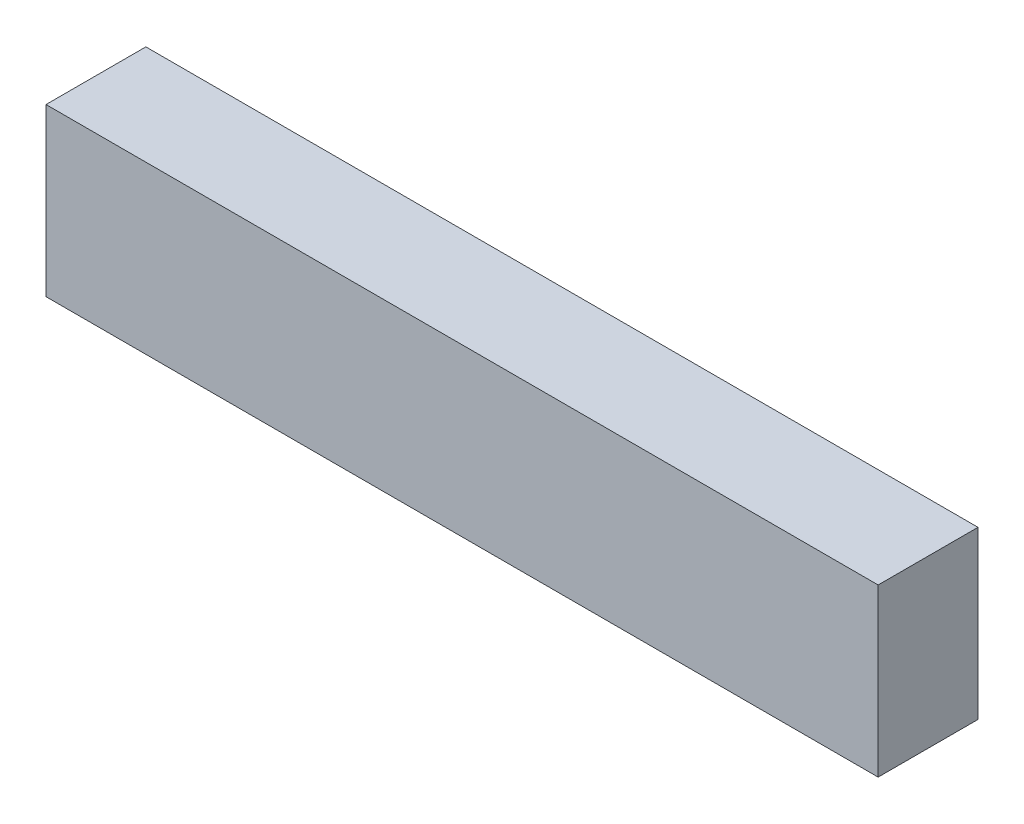
ISO-10303-21;
HEADER;
FILE_DESCRIPTION(('STEP AP214'),'2;1');
FILE_NAME('part.step','',(''),(''),'','','');
FILE_SCHEMA(('AUTOMOTIVE_DESIGN { 1 0 10303 214 1 1 1 1 }'));
ENDSEC;
DATA;
#1=APPLICATION_CONTEXT('core data for automotive mechanical design processes');
#2=APPLICATION_PROTOCOL_DEFINITION('international standard','automotive_design',2000,#1);
#3=PRODUCT_CONTEXT('',#1,'mechanical');
#4=PRODUCT('Part','Part','',(#3));
#5=PRODUCT_RELATED_PRODUCT_CATEGORY('part','',(#4));
#6=PRODUCT_DEFINITION_FORMATION('','',#4);
#7=PRODUCT_DEFINITION_CONTEXT('part definition',#1,'design');
#8=PRODUCT_DEFINITION('design','',#6,#7);
#9=PRODUCT_DEFINITION_SHAPE('','',#8);
#10=(LENGTH_UNIT() NAMED_UNIT(*) SI_UNIT(.MILLI.,.METRE.));
#11=(NAMED_UNIT(*) PLANE_ANGLE_UNIT() SI_UNIT($,.RADIAN.));
#12=(NAMED_UNIT(*) SI_UNIT($,.STERADIAN.) SOLID_ANGLE_UNIT());
#13=UNCERTAINTY_MEASURE_WITH_UNIT(LENGTH_MEASURE(1.E-05),#10,'distance_accuracy_value','');
#14=(GEOMETRIC_REPRESENTATION_CONTEXT(3) GLOBAL_UNCERTAINTY_ASSIGNED_CONTEXT((#13)) GLOBAL_UNIT_ASSIGNED_CONTEXT((#10,
#11,#12)) REPRESENTATION_CONTEXT('',''));
#15=CARTESIAN_POINT('',(0.,0.,0.));
#16=DIRECTION('',(0.,0.,1.));
#17=DIRECTION('',(1.,0.,0.));
#18=AXIS2_PLACEMENT_3D('',#15,#16,#17);
#19=CARTESIAN_POINT('',(0.,0.,6.));
#20=DIRECTION('',(1.,0.,0.));
#21=DIRECTION('',(0.,0.,-1.));
#22=AXIS2_PLACEMENT_3D('',#19,#20,#21);
#23=PLANE('',#22);
#24=DIRECTION('',(0.,-1.,0.));
#25=VECTOR('',#24,1.);
#26=CARTESIAN_POINT('',(0.,0.,0.));
#27=LINE('',#26,#25);
#28=CARTESIAN_POINT('',(0.,10.,0.));
#29=VERTEX_POINT('',#28);
#30=CARTESIAN_POINT('',(0.,0.,0.));
#31=VERTEX_POINT('',#30);
#32=EDGE_CURVE('E111',#29,#31,#27,.T.);
#33=ORIENTED_EDGE('',*,*,#32,.T.);
#34=DIRECTION('',(0.,0.,-1.));
#35=VECTOR('',#34,1.);
#36=CARTESIAN_POINT('',(0.,0.,6.));
#37=LINE('',#36,#35);
#38=CARTESIAN_POINT('',(0.,0.,6.));
#39=VERTEX_POINT('',#38);
#40=EDGE_CURVE('E11',#39,#31,#37,.T.);
#41=ORIENTED_EDGE('',*,*,#40,.F.);
#42=DIRECTION('',(0.,-1.,0.));
#43=VECTOR('',#42,1.);
#44=CARTESIAN_POINT('',(0.,0.,6.));
#45=LINE('',#44,#43);
#46=CARTESIAN_POINT('',(0.,10.,6.));
#47=VERTEX_POINT('',#46);
#48=EDGE_CURVE('E95',#47,#39,#45,.T.);
#49=ORIENTED_EDGE('',*,*,#48,.F.);
#50=DIRECTION('',(0.,0.,-1.));
#51=VECTOR('',#50,1.);
#52=CARTESIAN_POINT('',(0.,10.,6.));
#53=LINE('',#52,#51);
#54=EDGE_CURVE('E107',#47,#29,#53,.T.);
#55=ORIENTED_EDGE('',*,*,#54,.T.);
#56=EDGE_LOOP('',(#33,#41,#49,#55));
#57=FACE_BOUND('',#56,.T.);
#58=ADVANCED_FACE('F43',(#57),#23,.F.);
#59=CARTESIAN_POINT('',(0.,0.,6.));
#60=DIRECTION('',(0.,1.,0.));
#61=DIRECTION('',(0.,0.,1.));
#62=AXIS2_PLACEMENT_3D('',#59,#60,#61);
#63=PLANE('',#62);
#64=DIRECTION('',(1.,0.,0.));
#65=VECTOR('',#64,1.);
#66=CARTESIAN_POINT('',(0.,0.,0.));
#67=LINE('',#66,#65);
#68=CARTESIAN_POINT('',(50.,0.,0.));
#69=VERTEX_POINT('',#68);
#70=EDGE_CURVE('E100',#31,#69,#67,.T.);
#71=ORIENTED_EDGE('',*,*,#70,.T.);
#72=DIRECTION('',(0.,0.,-1.));
#73=VECTOR('',#72,1.);
#74=CARTESIAN_POINT('',(50.,0.,6.));
#75=LINE('',#74,#73);
#76=CARTESIAN_POINT('',(50.,0.,6.));
#77=VERTEX_POINT('',#76);
#78=EDGE_CURVE('E52',#77,#69,#75,.T.);
#79=ORIENTED_EDGE('',*,*,#78,.F.);
#80=DIRECTION('',(1.,0.,0.));
#81=VECTOR('',#80,1.);
#82=CARTESIAN_POINT('',(0.,0.,6.));
#83=LINE('',#82,#81);
#84=EDGE_CURVE('E90',#39,#77,#83,.T.);
#85=ORIENTED_EDGE('',*,*,#84,.F.);
#86=ORIENTED_EDGE('',*,*,#40,.T.);
#87=EDGE_LOOP('',(#71,#79,#85,#86));
#88=FACE_BOUND('',#87,.T.);
#89=ADVANCED_FACE('F99',(#88),#63,.F.);
#90=CARTESIAN_POINT('',(50.,0.,6.));
#91=DIRECTION('',(-1.,0.,0.));
#92=DIRECTION('',(0.,0.,1.));
#93=AXIS2_PLACEMENT_3D('',#90,#91,#92);
#94=PLANE('',#93);
#95=DIRECTION('',(0.,1.,0.));
#96=VECTOR('',#95,1.);
#97=CARTESIAN_POINT('',(50.,0.,0.));
#98=LINE('',#97,#96);
#99=CARTESIAN_POINT('',(50.,10.,0.));
#100=VERTEX_POINT('',#99);
#101=EDGE_CURVE('E77',#69,#100,#98,.T.);
#102=ORIENTED_EDGE('',*,*,#101,.T.);
#103=DIRECTION('',(0.,0.,-1.));
#104=VECTOR('',#103,1.);
#105=CARTESIAN_POINT('',(50.,10.,6.));
#106=LINE('',#105,#104);
#107=CARTESIAN_POINT('',(50.,10.,6.));
#108=VERTEX_POINT('',#107);
#109=EDGE_CURVE('E102',#108,#100,#106,.T.);
#110=ORIENTED_EDGE('',*,*,#109,.F.);
#111=DIRECTION('',(0.,1.,0.));
#112=VECTOR('',#111,1.);
#113=CARTESIAN_POINT('',(50.,0.,6.));
#114=LINE('',#113,#112);
#115=EDGE_CURVE('E93',#77,#108,#114,.T.);
#116=ORIENTED_EDGE('',*,*,#115,.F.);
#117=ORIENTED_EDGE('',*,*,#78,.T.);
#118=EDGE_LOOP('',(#102,#110,#116,#117));
#119=FACE_BOUND('',#118,.T.);
#120=ADVANCED_FACE('F103',(#119),#94,.F.);
#121=CARTESIAN_POINT('',(0.,10.,6.));
#122=DIRECTION('',(0.,-1.,0.));
#123=DIRECTION('',(0.,0.,-1.));
#124=AXIS2_PLACEMENT_3D('',#121,#122,#123);
#125=PLANE('',#124);
#126=DIRECTION('',(-1.,0.,0.));
#127=VECTOR('',#126,1.);
#128=CARTESIAN_POINT('',(0.,10.,0.));
#129=LINE('',#128,#127);
#130=EDGE_CURVE('E83',#100,#29,#129,.T.);
#131=ORIENTED_EDGE('',*,*,#130,.T.);
#132=ORIENTED_EDGE('',*,*,#54,.F.);
#133=DIRECTION('',(-1.,0.,0.));
#134=VECTOR('',#133,1.);
#135=CARTESIAN_POINT('',(0.,10.,6.));
#136=LINE('',#135,#134);
#137=EDGE_CURVE('E60',#108,#47,#136,.T.);
#138=ORIENTED_EDGE('',*,*,#137,.F.);
#139=ORIENTED_EDGE('',*,*,#109,.T.);
#140=EDGE_LOOP('',(#131,#132,#138,#139));
#141=FACE_BOUND('',#140,.T.);
#142=ADVANCED_FACE('F124',(#141),#125,.F.);
#143=CARTESIAN_POINT('',(0.,0.,6.));
#144=DIRECTION('',(0.,0.,-1.));
#145=DIRECTION('',(-1.,0.,0.));
#146=AXIS2_PLACEMENT_3D('',#143,#144,#145);
#147=PLANE('',#146);
#148=ORIENTED_EDGE('',*,*,#48,.T.);
#149=ORIENTED_EDGE('',*,*,#84,.T.);
#150=ORIENTED_EDGE('',*,*,#115,.T.);
#151=ORIENTED_EDGE('',*,*,#137,.T.);
#152=EDGE_LOOP('',(#148,#149,#150,#151));
#153=FACE_BOUND('',#152,.T.);
#154=ADVANCED_FACE('F91',(#153),#147,.F.);
#155=CARTESIAN_POINT('',(0.,0.,0.));
#156=DIRECTION('',(0.,0.,-1.));
#157=DIRECTION('',(-1.,0.,0.));
#158=AXIS2_PLACEMENT_3D('',#155,#156,#157);
#159=PLANE('',#158);
#160=ORIENTED_EDGE('',*,*,#32,.F.);
#161=ORIENTED_EDGE('',*,*,#130,.F.);
#162=ORIENTED_EDGE('',*,*,#101,.F.);
#163=ORIENTED_EDGE('',*,*,#70,.F.);
#164=EDGE_LOOP('',(#160,#161,#162,#163));
#165=FACE_BOUND('',#164,.T.);
#166=ADVANCED_FACE('F127',(#165),#159,.T.);
#167=CLOSED_SHELL('',(#58,#89,#120,#142,#154,#166));
#168=MANIFOLD_SOLID_BREP('B2',#167);
#169=ADVANCED_BREP_SHAPE_REPRESENTATION('',(#18,#168),#14);
#170=SHAPE_DEFINITION_REPRESENTATION(#9,#169);
ENDSEC;
END-ISO-10303-21;
